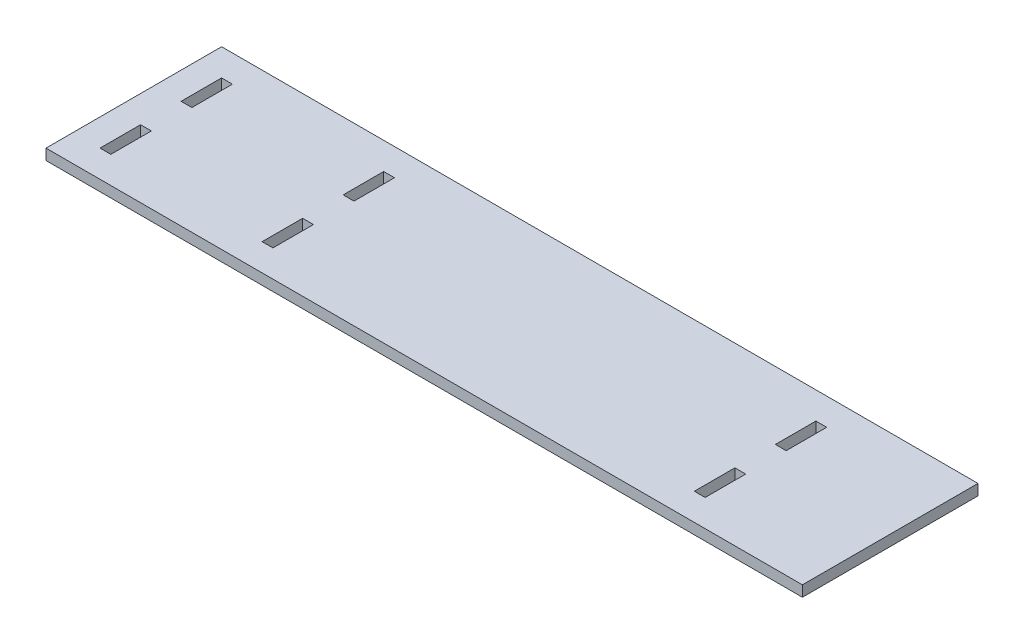
ISO-10303-21;
HEADER;
FILE_DESCRIPTION(('STEP AP214'),'2;1');
FILE_NAME('part.step','',(''),(''),'','','');
FILE_SCHEMA(('AUTOMOTIVE_DESIGN { 1 0 10303 214 1 1 1 1 }'));
ENDSEC;
DATA;
#1=APPLICATION_CONTEXT('core data for automotive mechanical design processes');
#2=APPLICATION_PROTOCOL_DEFINITION('international standard','automotive_design',2000,#1);
#3=PRODUCT_CONTEXT('',#1,'mechanical');
#4=PRODUCT('Part','Part','',(#3));
#5=PRODUCT_RELATED_PRODUCT_CATEGORY('part','',(#4));
#6=PRODUCT_DEFINITION_FORMATION('','',#4);
#7=PRODUCT_DEFINITION_CONTEXT('part definition',#1,'design');
#8=PRODUCT_DEFINITION('design','',#6,#7);
#9=PRODUCT_DEFINITION_SHAPE('','',#8);
#10=(LENGTH_UNIT() NAMED_UNIT(*) SI_UNIT(.MILLI.,.METRE.));
#11=(NAMED_UNIT(*) PLANE_ANGLE_UNIT() SI_UNIT($,.RADIAN.));
#12=(NAMED_UNIT(*) SI_UNIT($,.STERADIAN.) SOLID_ANGLE_UNIT());
#13=UNCERTAINTY_MEASURE_WITH_UNIT(LENGTH_MEASURE(1.E-05),#10,'distance_accuracy_value','');
#14=(GEOMETRIC_REPRESENTATION_CONTEXT(3) GLOBAL_UNCERTAINTY_ASSIGNED_CONTEXT((#13)) GLOBAL_UNIT_ASSIGNED_CONTEXT((#10,
#11,#12)) REPRESENTATION_CONTEXT('',''));
#15=CARTESIAN_POINT('',(0.,0.,0.));
#16=DIRECTION('',(0.,0.,1.));
#17=DIRECTION('',(1.,0.,0.));
#18=AXIS2_PLACEMENT_3D('',#15,#16,#17);
#19=CARTESIAN_POINT('',(0.,4.,0.));
#20=DIRECTION('',(0.,-1.,0.));
#21=DIRECTION('',(0.,0.,-1.));
#22=AXIS2_PLACEMENT_3D('',#19,#20,#21);
#23=PLANE('',#22);
#24=DIRECTION('',(-1.,0.,0.));
#25=VECTOR('',#24,1.);
#26=CARTESIAN_POINT('',(0.,4.,-9.99999999999997));
#27=LINE('',#26,#25);
#28=CARTESIAN_POINT('',(74.,4.,-10.));
#29=VERTEX_POINT('',#28);
#30=CARTESIAN_POINT('',(70.,4.,-10.));
#31=VERTEX_POINT('',#30);
#32=EDGE_CURVE('E56',#29,#31,#27,.T.);
#33=ORIENTED_EDGE('',*,*,#32,.T.);
#34=DIRECTION('',(0.,0.,-1.));
#35=VECTOR('',#34,1.);
#36=CARTESIAN_POINT('',(70.,4.,0.));
#37=LINE('',#36,#35);
#38=CARTESIAN_POINT('',(70.,4.,-25.));
#39=VERTEX_POINT('',#38);
#40=EDGE_CURVE('E301',#31,#39,#37,.T.);
#41=ORIENTED_EDGE('',*,*,#40,.T.);
#42=DIRECTION('',(-1.,0.,0.));
#43=VECTOR('',#42,1.);
#44=CARTESIAN_POINT('',(0.,4.,-25.0000000000001));
#45=LINE('',#44,#43);
#46=CARTESIAN_POINT('',(74.,4.,-25.));
#47=VERTEX_POINT('',#46);
#48=EDGE_CURVE('E304',#47,#39,#45,.T.);
#49=ORIENTED_EDGE('',*,*,#48,.F.);
#50=DIRECTION('',(0.,0.,-1.));
#51=VECTOR('',#50,1.);
#52=CARTESIAN_POINT('',(74.,4.,0.));
#53=LINE('',#52,#51);
#54=EDGE_CURVE('E308',#29,#47,#53,.T.);
#55=ORIENTED_EDGE('',*,*,#54,.F.);
#56=EDGE_LOOP('',(#33,#41,#49,#55));
#57=FACE_BOUND('',#56,.T.);
#58=DIRECTION('',(1.,0.,0.));
#59=VECTOR('',#58,1.);
#60=CARTESIAN_POINT('',(230.,4.,-55.));
#61=LINE('',#60,#59);
#62=CARTESIAN_POINT('',(230.,4.,-55.));
#63=VERTEX_POINT('',#62);
#64=CARTESIAN_POINT('',(234.,4.,-55.));
#65=VERTEX_POINT('',#64);
#66=EDGE_CURVE('E331',#63,#65,#61,.T.);
#67=ORIENTED_EDGE('',*,*,#66,.T.);
#68=DIRECTION('',(0.,0.,1.));
#69=VECTOR('',#68,1.);
#70=CARTESIAN_POINT('',(234.,4.,-55.));
#71=LINE('',#70,#69);
#72=CARTESIAN_POINT('',(234.,4.,-40.));
#73=VERTEX_POINT('',#72);
#74=EDGE_CURVE('E366',#65,#73,#71,.T.);
#75=ORIENTED_EDGE('',*,*,#74,.T.);
#76=DIRECTION('',(1.,0.,0.));
#77=VECTOR('',#76,1.);
#78=CARTESIAN_POINT('',(230.,4.,-40.));
#79=LINE('',#78,#77);
#80=CARTESIAN_POINT('',(230.,4.,-40.));
#81=VERTEX_POINT('',#80);
#82=EDGE_CURVE('E362',#81,#73,#79,.T.);
#83=ORIENTED_EDGE('',*,*,#82,.F.);
#84=DIRECTION('',(0.,0.,1.));
#85=VECTOR('',#84,1.);
#86=CARTESIAN_POINT('',(230.,4.,-55.));
#87=LINE('',#86,#85);
#88=EDGE_CURVE('E359',#63,#81,#87,.T.);
#89=ORIENTED_EDGE('',*,*,#88,.F.);
#90=EDGE_LOOP('',(#67,#75,#83,#89));
#91=FACE_BOUND('',#90,.T.);
#92=DIRECTION('',(0.,0.,1.));
#93=VECTOR('',#92,1.);
#94=CARTESIAN_POINT('',(230.,4.,-25.));
#95=LINE('',#94,#93);
#96=CARTESIAN_POINT('',(230.,4.,-25.));
#97=VERTEX_POINT('',#96);
#98=CARTESIAN_POINT('',(230.,4.,-10.));
#99=VERTEX_POINT('',#98);
#100=EDGE_CURVE('E243',#97,#99,#95,.T.);
#101=ORIENTED_EDGE('',*,*,#100,.F.);
#102=DIRECTION('',(-1.,0.,0.));
#103=VECTOR('',#102,1.);
#104=CARTESIAN_POINT('',(234.,4.,-25.));
#105=LINE('',#104,#103);
#106=CARTESIAN_POINT('',(234.,4.,-25.));
#107=VERTEX_POINT('',#106);
#108=EDGE_CURVE('E223',#107,#97,#105,.T.);
#109=ORIENTED_EDGE('',*,*,#108,.F.);
#110=DIRECTION('',(0.,0.,1.));
#111=VECTOR('',#110,1.);
#112=CARTESIAN_POINT('',(234.,4.,-25.));
#113=LINE('',#112,#111);
#114=CARTESIAN_POINT('',(234.,4.,-10.));
#115=VERTEX_POINT('',#114);
#116=EDGE_CURVE('E232',#107,#115,#113,.T.);
#117=ORIENTED_EDGE('',*,*,#116,.T.);
#118=DIRECTION('',(-1.,0.,0.));
#119=VECTOR('',#118,1.);
#120=CARTESIAN_POINT('',(234.,4.,-10.));
#121=LINE('',#120,#119);
#122=EDGE_CURVE('E238',#115,#99,#121,.T.);
#123=ORIENTED_EDGE('',*,*,#122,.T.);
#124=EDGE_LOOP('',(#101,#109,#117,#123));
#125=FACE_BOUND('',#124,.T.);
#126=DIRECTION('',(0.,0.,1.));
#127=VECTOR('',#126,1.);
#128=CARTESIAN_POINT('',(0.,4.,0.));
#129=LINE('',#128,#127);
#130=CARTESIAN_POINT('',(0.,4.,-65.));
#131=VERTEX_POINT('',#130);
#132=CARTESIAN_POINT('',(0.,4.,0.));
#133=VERTEX_POINT('',#132);
#134=EDGE_CURVE('E411',#131,#133,#129,.T.);
#135=ORIENTED_EDGE('',*,*,#134,.T.);
#136=DIRECTION('',(1.,0.,0.));
#137=VECTOR('',#136,1.);
#138=CARTESIAN_POINT('',(0.,4.,0.));
#139=LINE('',#138,#137);
#140=CARTESIAN_POINT('',(280.,4.,0.));
#141=VERTEX_POINT('',#140);
#142=EDGE_CURVE('E414',#133,#141,#139,.T.);
#143=ORIENTED_EDGE('',*,*,#142,.T.);
#144=DIRECTION('',(0.,0.,-1.));
#145=VECTOR('',#144,1.);
#146=CARTESIAN_POINT('',(280.,4.,0.));
#147=LINE('',#146,#145);
#148=CARTESIAN_POINT('',(280.,4.,-65.));
#149=VERTEX_POINT('',#148);
#150=EDGE_CURVE('E417',#141,#149,#147,.T.);
#151=ORIENTED_EDGE('',*,*,#150,.T.);
#152=DIRECTION('',(-1.,0.,0.));
#153=VECTOR('',#152,1.);
#154=CARTESIAN_POINT('',(0.,4.,-65.));
#155=LINE('',#154,#153);
#156=EDGE_CURVE('E419',#149,#131,#155,.T.);
#157=ORIENTED_EDGE('',*,*,#156,.T.);
#158=EDGE_LOOP('',(#135,#143,#151,#157));
#159=FACE_BOUND('',#158,.T.);
#160=DIRECTION('',(0.,0.,-1.));
#161=VECTOR('',#160,1.);
#162=CARTESIAN_POINT('',(10.,4.,0.));
#163=LINE('',#162,#161);
#164=CARTESIAN_POINT('',(10.,4.,-39.9999999999996));
#165=VERTEX_POINT('',#164);
#166=CARTESIAN_POINT('',(10.,4.,-54.9999999999996));
#167=VERTEX_POINT('',#166);
#168=EDGE_CURVE('E282',#165,#167,#163,.T.);
#169=ORIENTED_EDGE('',*,*,#168,.T.);
#170=DIRECTION('',(1.,0.,0.));
#171=VECTOR('',#170,1.);
#172=CARTESIAN_POINT('',(0.,4.,-54.9999999999996));
#173=LINE('',#172,#171);
#174=CARTESIAN_POINT('',(14.,4.,-54.9999999999996));
#175=VERTEX_POINT('',#174);
#176=EDGE_CURVE('E382',#167,#175,#173,.T.);
#177=ORIENTED_EDGE('',*,*,#176,.T.);
#178=DIRECTION('',(0.,0.,-1.));
#179=VECTOR('',#178,1.);
#180=CARTESIAN_POINT('',(14.,4.,0.));
#181=LINE('',#180,#179);
#182=CARTESIAN_POINT('',(14.,4.,-39.9999999999996));
#183=VERTEX_POINT('',#182);
#184=EDGE_CURVE('E396',#183,#175,#181,.T.);
#185=ORIENTED_EDGE('',*,*,#184,.F.);
#186=DIRECTION('',(1.,0.,0.));
#187=VECTOR('',#186,1.);
#188=CARTESIAN_POINT('',(0.,4.,-39.9999999999996));
#189=LINE('',#188,#187);
#190=EDGE_CURVE('E393',#165,#183,#189,.T.);
#191=ORIENTED_EDGE('',*,*,#190,.F.);
#192=EDGE_LOOP('',(#169,#177,#185,#191));
#193=FACE_BOUND('',#192,.T.);
#194=DIRECTION('',(0.,0.,-1.));
#195=VECTOR('',#194,1.);
#196=CARTESIAN_POINT('',(70.,4.,0.));
#197=LINE('',#196,#195);
#198=CARTESIAN_POINT('',(70.,4.,-40.));
#199=VERTEX_POINT('',#198);
#200=CARTESIAN_POINT('',(70.,4.,-55.));
#201=VERTEX_POINT('',#200);
#202=EDGE_CURVE('E300',#199,#201,#197,.T.);
#203=ORIENTED_EDGE('',*,*,#202,.T.);
#204=DIRECTION('',(1.,0.,0.));
#205=VECTOR('',#204,1.);
#206=CARTESIAN_POINT('',(0.,4.,-55.));
#207=LINE('',#206,#205);
#208=CARTESIAN_POINT('',(74.,4.,-55.));
#209=VERTEX_POINT('',#208);
#210=EDGE_CURVE('E332',#201,#209,#207,.T.);
#211=ORIENTED_EDGE('',*,*,#210,.T.);
#212=DIRECTION('',(0.,0.,-1.));
#213=VECTOR('',#212,1.);
#214=CARTESIAN_POINT('',(74.,4.,0.));
#215=LINE('',#214,#213);
#216=CARTESIAN_POINT('',(74.,4.,-40.));
#217=VERTEX_POINT('',#216);
#218=EDGE_CURVE('E335',#217,#209,#215,.T.);
#219=ORIENTED_EDGE('',*,*,#218,.F.);
#220=DIRECTION('',(1.,0.,0.));
#221=VECTOR('',#220,1.);
#222=CARTESIAN_POINT('',(0.,4.,-40.));
#223=LINE('',#222,#221);
#224=EDGE_CURVE('E339',#199,#217,#223,.T.);
#225=ORIENTED_EDGE('',*,*,#224,.F.);
#226=EDGE_LOOP('',(#203,#211,#219,#225));
#227=FACE_BOUND('',#226,.T.);
#228=DIRECTION('',(-1.,0.,0.));
#229=VECTOR('',#228,1.);
#230=CARTESIAN_POINT('',(0.,4.,-9.99999999999958));
#231=LINE('',#230,#229);
#232=CARTESIAN_POINT('',(14.,4.,-9.99999999999958));
#233=VERTEX_POINT('',#232);
#234=CARTESIAN_POINT('',(10.,4.,-9.99999999999958));
#235=VERTEX_POINT('',#234);
#236=EDGE_CURVE('E48',#233,#235,#231,.T.);
#237=ORIENTED_EDGE('',*,*,#236,.T.);
#238=DIRECTION('',(0.,0.,-1.));
#239=VECTOR('',#238,1.);
#240=CARTESIAN_POINT('',(10.,4.,0.));
#241=LINE('',#240,#239);
#242=CARTESIAN_POINT('',(10.,4.,-24.9999999999996));
#243=VERTEX_POINT('',#242);
#244=EDGE_CURVE('E271',#235,#243,#241,.T.);
#245=ORIENTED_EDGE('',*,*,#244,.T.);
#246=DIRECTION('',(-1.,0.,0.));
#247=VECTOR('',#246,1.);
#248=CARTESIAN_POINT('',(0.,4.,-24.9999999999996));
#249=LINE('',#248,#247);
#250=CARTESIAN_POINT('',(14.,4.,-24.9999999999996));
#251=VERTEX_POINT('',#250);
#252=EDGE_CURVE('E274',#251,#243,#249,.T.);
#253=ORIENTED_EDGE('',*,*,#252,.F.);
#254=DIRECTION('',(0.,0.,-1.));
#255=VECTOR('',#254,1.);
#256=CARTESIAN_POINT('',(14.,4.,0.));
#257=LINE('',#256,#255);
#258=EDGE_CURVE('E278',#233,#251,#257,.T.);
#259=ORIENTED_EDGE('',*,*,#258,.F.);
#260=EDGE_LOOP('',(#237,#245,#253,#259));
#261=FACE_BOUND('',#260,.T.);
#262=ADVANCED_FACE('F33',(#57,#91,#125,#159,#193,#227,#261),#23,.F.);
#263=CARTESIAN_POINT('',(0.,0.,0.));
#264=DIRECTION('',(0.,-1.,0.));
#265=DIRECTION('',(0.,0.,-1.));
#266=AXIS2_PLACEMENT_3D('',#263,#264,#265);
#267=PLANE('',#266);
#268=DIRECTION('',(-1.,0.,0.));
#269=VECTOR('',#268,1.);
#270=CARTESIAN_POINT('',(234.,0.,-25.));
#271=LINE('',#270,#269);
#272=CARTESIAN_POINT('',(234.,0.,-25.));
#273=VERTEX_POINT('',#272);
#274=CARTESIAN_POINT('',(230.,0.,-25.));
#275=VERTEX_POINT('',#274);
#276=EDGE_CURVE('E226',#273,#275,#271,.T.);
#277=ORIENTED_EDGE('',*,*,#276,.T.);
#278=DIRECTION('',(0.,0.,1.));
#279=VECTOR('',#278,1.);
#280=CARTESIAN_POINT('',(230.,0.,-25.));
#281=LINE('',#280,#279);
#282=CARTESIAN_POINT('',(230.,0.,-10.));
#283=VERTEX_POINT('',#282);
#284=EDGE_CURVE('E258',#275,#283,#281,.T.);
#285=ORIENTED_EDGE('',*,*,#284,.T.);
#286=DIRECTION('',(-1.,0.,0.));
#287=VECTOR('',#286,1.);
#288=CARTESIAN_POINT('',(234.,0.,-10.));
#289=LINE('',#288,#287);
#290=CARTESIAN_POINT('',(234.,0.,-10.));
#291=VERTEX_POINT('',#290);
#292=EDGE_CURVE('E254',#291,#283,#289,.T.);
#293=ORIENTED_EDGE('',*,*,#292,.F.);
#294=DIRECTION('',(0.,0.,1.));
#295=VECTOR('',#294,1.);
#296=CARTESIAN_POINT('',(234.,0.,-25.));
#297=LINE('',#296,#295);
#298=EDGE_CURVE('E252',#273,#291,#297,.T.);
#299=ORIENTED_EDGE('',*,*,#298,.F.);
#300=EDGE_LOOP('',(#277,#285,#293,#299));
#301=FACE_BOUND('',#300,.T.);
#302=DIRECTION('',(0.,0.,1.));
#303=VECTOR('',#302,1.);
#304=CARTESIAN_POINT('',(0.,0.,0.));
#305=LINE('',#304,#303);
#306=CARTESIAN_POINT('',(0.,0.,-65.));
#307=VERTEX_POINT('',#306);
#308=CARTESIAN_POINT('',(0.,0.,0.));
#309=VERTEX_POINT('',#308);
#310=EDGE_CURVE('E404',#307,#309,#305,.T.);
#311=ORIENTED_EDGE('',*,*,#310,.F.);
#312=DIRECTION('',(-1.,0.,0.));
#313=VECTOR('',#312,1.);
#314=CARTESIAN_POINT('',(0.,0.,-65.));
#315=LINE('',#314,#313);
#316=CARTESIAN_POINT('',(280.,0.,-65.));
#317=VERTEX_POINT('',#316);
#318=EDGE_CURVE('E415',#317,#307,#315,.T.);
#319=ORIENTED_EDGE('',*,*,#318,.F.);
#320=DIRECTION('',(0.,0.,-1.));
#321=VECTOR('',#320,1.);
#322=CARTESIAN_POINT('',(280.,0.,0.));
#323=LINE('',#322,#321);
#324=CARTESIAN_POINT('',(280.,0.,0.));
#325=VERTEX_POINT('',#324);
#326=EDGE_CURVE('E426',#325,#317,#323,.T.);
#327=ORIENTED_EDGE('',*,*,#326,.F.);
#328=DIRECTION('',(1.,0.,0.));
#329=VECTOR('',#328,1.);
#330=CARTESIAN_POINT('',(0.,0.,0.));
#331=LINE('',#330,#329);
#332=EDGE_CURVE('E424',#309,#325,#331,.T.);
#333=ORIENTED_EDGE('',*,*,#332,.F.);
#334=EDGE_LOOP('',(#311,#319,#327,#333));
#335=FACE_BOUND('',#334,.T.);
#336=DIRECTION('',(1.,0.,0.));
#337=VECTOR('',#336,1.);
#338=CARTESIAN_POINT('',(0.,0.,-54.9999999999996));
#339=LINE('',#338,#337);
#340=CARTESIAN_POINT('',(10.,0.,-54.9999999999996));
#341=VERTEX_POINT('',#340);
#342=CARTESIAN_POINT('',(14.,0.,-54.9999999999996));
#343=VERTEX_POINT('',#342);
#344=EDGE_CURVE('E388',#341,#343,#339,.T.);
#345=ORIENTED_EDGE('',*,*,#344,.F.);
#346=DIRECTION('',(0.,0.,-1.));
#347=VECTOR('',#346,1.);
#348=CARTESIAN_POINT('',(10.,0.,0.));
#349=LINE('',#348,#347);
#350=CARTESIAN_POINT('',(10.,0.,-39.9999999999996));
#351=VERTEX_POINT('',#350);
#352=EDGE_CURVE('E379',#351,#341,#349,.T.);
#353=ORIENTED_EDGE('',*,*,#352,.F.);
#354=DIRECTION('',(1.,0.,0.));
#355=VECTOR('',#354,1.);
#356=CARTESIAN_POINT('',(0.,0.,-39.9999999999996));
#357=LINE('',#356,#355);
#358=CARTESIAN_POINT('',(14.,0.,-39.9999999999996));
#359=VERTEX_POINT('',#358);
#360=EDGE_CURVE('E381',#351,#359,#357,.T.);
#361=ORIENTED_EDGE('',*,*,#360,.T.);
#362=DIRECTION('',(0.,0.,-1.));
#363=VECTOR('',#362,1.);
#364=CARTESIAN_POINT('',(14.,0.,0.));
#365=LINE('',#364,#363);
#366=EDGE_CURVE('E385',#359,#343,#365,.T.);
#367=ORIENTED_EDGE('',*,*,#366,.T.);
#368=EDGE_LOOP('',(#345,#353,#361,#367));
#369=FACE_BOUND('',#368,.T.);
#370=DIRECTION('',(0.,0.,1.));
#371=VECTOR('',#370,1.);
#372=CARTESIAN_POINT('',(234.,0.,-55.));
#373=LINE('',#372,#371);
#374=CARTESIAN_POINT('',(234.,0.,-55.));
#375=VERTEX_POINT('',#374);
#376=CARTESIAN_POINT('',(234.,0.,-40.));
#377=VERTEX_POINT('',#376);
#378=EDGE_CURVE('E376',#375,#377,#373,.T.);
#379=ORIENTED_EDGE('',*,*,#378,.F.);
#380=DIRECTION('',(1.,0.,0.));
#381=VECTOR('',#380,1.);
#382=CARTESIAN_POINT('',(230.,0.,-55.));
#383=LINE('',#382,#381);
#384=CARTESIAN_POINT('',(230.,0.,-55.));
#385=VERTEX_POINT('',#384);
#386=EDGE_CURVE('E363',#385,#375,#383,.T.);
#387=ORIENTED_EDGE('',*,*,#386,.F.);
#388=DIRECTION('',(0.,0.,1.));
#389=VECTOR('',#388,1.);
#390=CARTESIAN_POINT('',(230.,0.,-55.));
#391=LINE('',#390,#389);
#392=CARTESIAN_POINT('',(230.,0.,-40.));
#393=VERTEX_POINT('',#392);
#394=EDGE_CURVE('E358',#385,#393,#391,.T.);
#395=ORIENTED_EDGE('',*,*,#394,.T.);
#396=DIRECTION('',(1.,0.,0.));
#397=VECTOR('',#396,1.);
#398=CARTESIAN_POINT('',(230.,0.,-40.));
#399=LINE('',#398,#397);
#400=EDGE_CURVE('E373',#393,#377,#399,.T.);
#401=ORIENTED_EDGE('',*,*,#400,.T.);
#402=EDGE_LOOP('',(#379,#387,#395,#401));
#403=FACE_BOUND('',#402,.T.);
#404=DIRECTION('',(1.,0.,0.));
#405=VECTOR('',#404,1.);
#406=CARTESIAN_POINT('',(0.,0.,-55.));
#407=LINE('',#406,#405);
#408=CARTESIAN_POINT('',(70.,0.,-55.));
#409=VERTEX_POINT('',#408);
#410=CARTESIAN_POINT('',(74.,0.,-55.));
#411=VERTEX_POINT('',#410);
#412=EDGE_CURVE('E323',#409,#411,#407,.T.);
#413=ORIENTED_EDGE('',*,*,#412,.F.);
#414=DIRECTION('',(0.,0.,-1.));
#415=VECTOR('',#414,1.);
#416=CARTESIAN_POINT('',(70.,0.,0.));
#417=LINE('',#416,#415);
#418=CARTESIAN_POINT('',(70.,0.,-40.));
#419=VERTEX_POINT('',#418);
#420=EDGE_CURVE('E336',#419,#409,#417,.T.);
#421=ORIENTED_EDGE('',*,*,#420,.F.);
#422=DIRECTION('',(1.,0.,0.));
#423=VECTOR('',#422,1.);
#424=CARTESIAN_POINT('',(0.,0.,-40.));
#425=LINE('',#424,#423);
#426=CARTESIAN_POINT('',(74.,0.,-40.));
#427=VERTEX_POINT('',#426);
#428=EDGE_CURVE('E348',#419,#427,#425,.T.);
#429=ORIENTED_EDGE('',*,*,#428,.T.);
#430=DIRECTION('',(0.,0.,-1.));
#431=VECTOR('',#430,1.);
#432=CARTESIAN_POINT('',(74.,0.,0.));
#433=LINE('',#432,#431);
#434=EDGE_CURVE('E345',#427,#411,#433,.T.);
#435=ORIENTED_EDGE('',*,*,#434,.T.);
#436=EDGE_LOOP('',(#413,#421,#429,#435));
#437=FACE_BOUND('',#436,.T.);
#438=DIRECTION('',(0.,0.,-1.));
#439=VECTOR('',#438,1.);
#440=CARTESIAN_POINT('',(70.,0.,0.));
#441=LINE('',#440,#439);
#442=CARTESIAN_POINT('',(70.,0.,-10.));
#443=VERTEX_POINT('',#442);
#444=CARTESIAN_POINT('',(70.,0.,-25.));
#445=VERTEX_POINT('',#444);
#446=EDGE_CURVE('E293',#443,#445,#441,.T.);
#447=ORIENTED_EDGE('',*,*,#446,.F.);
#448=DIRECTION('',(-1.,0.,0.));
#449=VECTOR('',#448,1.);
#450=CARTESIAN_POINT('',(0.,0.,-9.99999999999997));
#451=LINE('',#450,#449);
#452=CARTESIAN_POINT('',(74.,0.,-10.));
#453=VERTEX_POINT('',#452);
#454=EDGE_CURVE('E305',#453,#443,#451,.T.);
#455=ORIENTED_EDGE('',*,*,#454,.F.);
#456=DIRECTION('',(0.,0.,-1.));
#457=VECTOR('',#456,1.);
#458=CARTESIAN_POINT('',(74.,0.,0.));
#459=LINE('',#458,#457);
#460=CARTESIAN_POINT('',(74.,0.,-25.));
#461=VERTEX_POINT('',#460);
#462=EDGE_CURVE('E316',#453,#461,#459,.T.);
#463=ORIENTED_EDGE('',*,*,#462,.T.);
#464=DIRECTION('',(-1.,0.,0.));
#465=VECTOR('',#464,1.);
#466=CARTESIAN_POINT('',(0.,0.,-25.0000000000001));
#467=LINE('',#466,#465);
#468=EDGE_CURVE('E313',#461,#445,#467,.T.);
#469=ORIENTED_EDGE('',*,*,#468,.T.);
#470=EDGE_LOOP('',(#447,#455,#463,#469));
#471=FACE_BOUND('',#470,.T.);
#472=DIRECTION('',(0.,0.,-1.));
#473=VECTOR('',#472,1.);
#474=CARTESIAN_POINT('',(10.,0.,0.));
#475=LINE('',#474,#473);
#476=CARTESIAN_POINT('',(10.,0.,-9.99999999999958));
#477=VERTEX_POINT('',#476);
#478=CARTESIAN_POINT('',(10.,0.,-24.9999999999996));
#479=VERTEX_POINT('',#478);
#480=EDGE_CURVE('E264',#477,#479,#475,.T.);
#481=ORIENTED_EDGE('',*,*,#480,.F.);
#482=DIRECTION('',(-1.,0.,0.));
#483=VECTOR('',#482,1.);
#484=CARTESIAN_POINT('',(0.,0.,-9.99999999999958));
#485=LINE('',#484,#483);
#486=CARTESIAN_POINT('',(14.,0.,-9.99999999999958));
#487=VERTEX_POINT('',#486);
#488=EDGE_CURVE('E275',#487,#477,#485,.T.);
#489=ORIENTED_EDGE('',*,*,#488,.F.);
#490=DIRECTION('',(0.,0.,-1.));
#491=VECTOR('',#490,1.);
#492=CARTESIAN_POINT('',(14.,0.,0.));
#493=LINE('',#492,#491);
#494=CARTESIAN_POINT('',(14.,0.,-24.9999999999996));
#495=VERTEX_POINT('',#494);
#496=EDGE_CURVE('E287',#487,#495,#493,.T.);
#497=ORIENTED_EDGE('',*,*,#496,.T.);
#498=DIRECTION('',(-1.,0.,0.));
#499=VECTOR('',#498,1.);
#500=CARTESIAN_POINT('',(0.,0.,-24.9999999999996));
#501=LINE('',#500,#499);
#502=EDGE_CURVE('E284',#495,#479,#501,.T.);
#503=ORIENTED_EDGE('',*,*,#502,.T.);
#504=EDGE_LOOP('',(#481,#489,#497,#503));
#505=FACE_BOUND('',#504,.T.);
#506=ADVANCED_FACE('F444',(#301,#335,#369,#403,#437,#471,#505),#267,.T.);
#507=CARTESIAN_POINT('',(0.,4.,0.));
#508=DIRECTION('',(1.,0.,0.));
#509=DIRECTION('',(0.,0.,-1.));
#510=AXIS2_PLACEMENT_3D('',#507,#508,#509);
#511=PLANE('',#510);
#512=ORIENTED_EDGE('',*,*,#310,.T.);
#513=DIRECTION('',(0.,-1.,0.));
#514=VECTOR('',#513,1.);
#515=CARTESIAN_POINT('',(0.,4.,0.));
#516=LINE('',#515,#514);
#517=EDGE_CURVE('E11',#133,#309,#516,.T.);
#518=ORIENTED_EDGE('',*,*,#517,.F.);
#519=ORIENTED_EDGE('',*,*,#134,.F.);
#520=DIRECTION('',(0.,-1.,0.));
#521=VECTOR('',#520,1.);
#522=CARTESIAN_POINT('',(0.,4.,-65.));
#523=LINE('',#522,#521);
#524=EDGE_CURVE('E421',#131,#307,#523,.T.);
#525=ORIENTED_EDGE('',*,*,#524,.T.);
#526=EDGE_LOOP('',(#512,#518,#519,#525));
#527=FACE_BOUND('',#526,.T.);
#528=ADVANCED_FACE('F35',(#527),#511,.F.);
#529=CARTESIAN_POINT('',(0.,4.,0.));
#530=DIRECTION('',(0.,0.,-1.));
#531=DIRECTION('',(-1.,0.,0.));
#532=AXIS2_PLACEMENT_3D('',#529,#530,#531);
#533=PLANE('',#532);
#534=ORIENTED_EDGE('',*,*,#332,.T.);
#535=DIRECTION('',(0.,-1.,0.));
#536=VECTOR('',#535,1.);
#537=CARTESIAN_POINT('',(280.,4.,0.));
#538=LINE('',#537,#536);
#539=EDGE_CURVE('E41',#141,#325,#538,.T.);
#540=ORIENTED_EDGE('',*,*,#539,.F.);
#541=ORIENTED_EDGE('',*,*,#142,.F.);
#542=ORIENTED_EDGE('',*,*,#517,.T.);
#543=EDGE_LOOP('',(#534,#540,#541,#542));
#544=FACE_BOUND('',#543,.T.);
#545=ADVANCED_FACE('F454',(#544),#533,.F.);
#546=CARTESIAN_POINT('',(280.,4.,0.));
#547=DIRECTION('',(-1.,0.,0.));
#548=DIRECTION('',(0.,0.,1.));
#549=AXIS2_PLACEMENT_3D('',#546,#547,#548);
#550=PLANE('',#549);
#551=ORIENTED_EDGE('',*,*,#326,.T.);
#552=DIRECTION('',(0.,-1.,0.));
#553=VECTOR('',#552,1.);
#554=CARTESIAN_POINT('',(280.,4.,-65.));
#555=LINE('',#554,#553);
#556=EDGE_CURVE('E431',#149,#317,#555,.T.);
#557=ORIENTED_EDGE('',*,*,#556,.F.);
#558=ORIENTED_EDGE('',*,*,#150,.F.);
#559=ORIENTED_EDGE('',*,*,#539,.T.);
#560=EDGE_LOOP('',(#551,#557,#558,#559));
#561=FACE_BOUND('',#560,.T.);
#562=ADVANCED_FACE('F438',(#561),#550,.F.);
#563=CARTESIAN_POINT('',(0.,4.,-65.));
#564=DIRECTION('',(0.,0.,1.));
#565=DIRECTION('',(1.,0.,0.));
#566=AXIS2_PLACEMENT_3D('',#563,#564,#565);
#567=PLANE('',#566);
#568=ORIENTED_EDGE('',*,*,#318,.T.);
#569=ORIENTED_EDGE('',*,*,#524,.F.);
#570=ORIENTED_EDGE('',*,*,#156,.F.);
#571=ORIENTED_EDGE('',*,*,#556,.T.);
#572=EDGE_LOOP('',(#568,#569,#570,#571));
#573=FACE_BOUND('',#572,.T.);
#574=ADVANCED_FACE('F448',(#573),#567,.F.);
#575=CARTESIAN_POINT('',(10.,0.,0.));
#576=DIRECTION('',(1.,0.,0.));
#577=DIRECTION('',(0.,0.,-1.));
#578=AXIS2_PLACEMENT_3D('',#575,#576,#577);
#579=PLANE('',#578);
#580=ORIENTED_EDGE('',*,*,#168,.F.);
#581=DIRECTION('',(0.,1.,0.));
#582=VECTOR('',#581,1.);
#583=CARTESIAN_POINT('',(10.,0.,-39.9999999999996));
#584=LINE('',#583,#582);
#585=EDGE_CURVE('E390',#351,#165,#584,.T.);
#586=ORIENTED_EDGE('',*,*,#585,.F.);
#587=ORIENTED_EDGE('',*,*,#352,.T.);
#588=DIRECTION('',(0.,1.,0.));
#589=VECTOR('',#588,1.);
#590=CARTESIAN_POINT('',(10.,0.,-54.9999999999996));
#591=LINE('',#590,#589);
#592=EDGE_CURVE('E401',#341,#167,#591,.T.);
#593=ORIENTED_EDGE('',*,*,#592,.T.);
#594=EDGE_LOOP('',(#580,#586,#587,#593));
#595=FACE_BOUND('',#594,.T.);
#596=ADVANCED_FACE('F471',(#595),#579,.T.);
#597=CARTESIAN_POINT('',(0.,0.,-54.9999999999996));
#598=DIRECTION('',(0.,0.,1.));
#599=DIRECTION('',(1.,0.,0.));
#600=AXIS2_PLACEMENT_3D('',#597,#598,#599);
#601=PLANE('',#600);
#602=ORIENTED_EDGE('',*,*,#176,.F.);
#603=ORIENTED_EDGE('',*,*,#592,.F.);
#604=ORIENTED_EDGE('',*,*,#344,.T.);
#605=DIRECTION('',(0.,1.,0.));
#606=VECTOR('',#605,1.);
#607=CARTESIAN_POINT('',(14.,0.,-54.9999999999996));
#608=LINE('',#607,#606);
#609=EDGE_CURVE('E405',#343,#175,#608,.T.);
#610=ORIENTED_EDGE('',*,*,#609,.T.);
#611=EDGE_LOOP('',(#602,#603,#604,#610));
#612=FACE_BOUND('',#611,.T.);
#613=ADVANCED_FACE('F478',(#612),#601,.T.);
#614=CARTESIAN_POINT('',(14.,0.,0.));
#615=DIRECTION('',(1.,0.,0.));
#616=DIRECTION('',(0.,0.,-1.));
#617=AXIS2_PLACEMENT_3D('',#614,#615,#616);
#618=PLANE('',#617);
#619=ORIENTED_EDGE('',*,*,#184,.T.);
#620=ORIENTED_EDGE('',*,*,#609,.F.);
#621=ORIENTED_EDGE('',*,*,#366,.F.);
#622=DIRECTION('',(0.,1.,0.));
#623=VECTOR('',#622,1.);
#624=CARTESIAN_POINT('',(14.,0.,-39.9999999999996));
#625=LINE('',#624,#623);
#626=EDGE_CURVE('E407',#359,#183,#625,.T.);
#627=ORIENTED_EDGE('',*,*,#626,.T.);
#628=EDGE_LOOP('',(#619,#620,#621,#627));
#629=FACE_BOUND('',#628,.T.);
#630=ADVANCED_FACE('F483',(#629),#618,.F.);
#631=CARTESIAN_POINT('',(0.,0.,-39.9999999999996));
#632=DIRECTION('',(0.,0.,1.));
#633=DIRECTION('',(1.,0.,0.));
#634=AXIS2_PLACEMENT_3D('',#631,#632,#633);
#635=PLANE('',#634);
#636=ORIENTED_EDGE('',*,*,#190,.T.);
#637=ORIENTED_EDGE('',*,*,#626,.F.);
#638=ORIENTED_EDGE('',*,*,#360,.F.);
#639=ORIENTED_EDGE('',*,*,#585,.T.);
#640=EDGE_LOOP('',(#636,#637,#638,#639));
#641=FACE_BOUND('',#640,.T.);
#642=ADVANCED_FACE('F490',(#641),#635,.F.);
#643=CARTESIAN_POINT('',(234.,0.,-25.));
#644=DIRECTION('',(0.,0.,-1.));
#645=DIRECTION('',(-1.,0.,0.));
#646=AXIS2_PLACEMENT_3D('',#643,#644,#645);
#647=PLANE('',#646);
#648=ORIENTED_EDGE('',*,*,#108,.T.);
#649=DIRECTION('',(0.,1.,0.));
#650=VECTOR('',#649,1.);
#651=CARTESIAN_POINT('',(230.,0.,-25.));
#652=LINE('',#651,#650);
#653=EDGE_CURVE('E255',#275,#97,#652,.T.);
#654=ORIENTED_EDGE('',*,*,#653,.F.);
#655=ORIENTED_EDGE('',*,*,#276,.F.);
#656=DIRECTION('',(0.,1.,0.));
#657=VECTOR('',#656,1.);
#658=CARTESIAN_POINT('',(234.,0.,-25.));
#659=LINE('',#658,#657);
#660=EDGE_CURVE('E219',#273,#107,#659,.T.);
#661=ORIENTED_EDGE('',*,*,#660,.T.);
#662=EDGE_LOOP('',(#648,#654,#655,#661));
#663=FACE_BOUND('',#662,.T.);
#664=ADVANCED_FACE('F221',(#663),#647,.F.);
#665=CARTESIAN_POINT('',(234.,0.,-25.));
#666=DIRECTION('',(-1.,0.,0.));
#667=DIRECTION('',(0.,0.,1.));
#668=AXIS2_PLACEMENT_3D('',#665,#666,#667);
#669=PLANE('',#668);
#670=ORIENTED_EDGE('',*,*,#116,.F.);
#671=ORIENTED_EDGE('',*,*,#660,.F.);
#672=ORIENTED_EDGE('',*,*,#298,.T.);
#673=DIRECTION('',(0.,1.,0.));
#674=VECTOR('',#673,1.);
#675=CARTESIAN_POINT('',(234.,0.,-10.));
#676=LINE('',#675,#674);
#677=EDGE_CURVE('E229',#291,#115,#676,.T.);
#678=ORIENTED_EDGE('',*,*,#677,.T.);
#679=EDGE_LOOP('',(#670,#671,#672,#678));
#680=FACE_BOUND('',#679,.T.);
#681=ADVANCED_FACE('F233',(#680),#669,.T.);
#682=CARTESIAN_POINT('',(234.,0.,-10.));
#683=DIRECTION('',(0.,0.,-1.));
#684=DIRECTION('',(-1.,0.,0.));
#685=AXIS2_PLACEMENT_3D('',#682,#683,#684);
#686=PLANE('',#685);
#687=ORIENTED_EDGE('',*,*,#122,.F.);
#688=ORIENTED_EDGE('',*,*,#677,.F.);
#689=ORIENTED_EDGE('',*,*,#292,.T.);
#690=DIRECTION('',(0.,1.,0.));
#691=VECTOR('',#690,1.);
#692=CARTESIAN_POINT('',(230.,0.,-10.));
#693=LINE('',#692,#691);
#694=EDGE_CURVE('E602',#283,#99,#693,.T.);
#695=ORIENTED_EDGE('',*,*,#694,.T.);
#696=EDGE_LOOP('',(#687,#688,#689,#695));
#697=FACE_BOUND('',#696,.T.);
#698=ADVANCED_FACE('F592',(#697),#686,.T.);
#699=CARTESIAN_POINT('',(230.,0.,-25.));
#700=DIRECTION('',(-1.,0.,0.));
#701=DIRECTION('',(0.,0.,1.));
#702=AXIS2_PLACEMENT_3D('',#699,#700,#701);
#703=PLANE('',#702);
#704=ORIENTED_EDGE('',*,*,#100,.T.);
#705=ORIENTED_EDGE('',*,*,#694,.F.);
#706=ORIENTED_EDGE('',*,*,#284,.F.);
#707=ORIENTED_EDGE('',*,*,#653,.T.);
#708=EDGE_LOOP('',(#704,#705,#706,#707));
#709=FACE_BOUND('',#708,.T.);
#710=ADVANCED_FACE('F571',(#709),#703,.F.);
#711=CARTESIAN_POINT('',(230.,0.,-55.));
#712=DIRECTION('',(0.,0.,1.));
#713=DIRECTION('',(1.,0.,0.));
#714=AXIS2_PLACEMENT_3D('',#711,#712,#713);
#715=PLANE('',#714);
#716=ORIENTED_EDGE('',*,*,#66,.F.);
#717=DIRECTION('',(0.,1.,0.));
#718=VECTOR('',#717,1.);
#719=CARTESIAN_POINT('',(230.,0.,-55.));
#720=LINE('',#719,#718);
#721=EDGE_CURVE('E355',#385,#63,#720,.T.);
#722=ORIENTED_EDGE('',*,*,#721,.F.);
#723=ORIENTED_EDGE('',*,*,#386,.T.);
#724=DIRECTION('',(0.,1.,0.));
#725=VECTOR('',#724,1.);
#726=CARTESIAN_POINT('',(234.,0.,-55.));
#727=LINE('',#726,#725);
#728=EDGE_CURVE('E244',#375,#65,#727,.T.);
#729=ORIENTED_EDGE('',*,*,#728,.T.);
#730=EDGE_LOOP('',(#716,#722,#723,#729));
#731=FACE_BOUND('',#730,.T.);
#732=ADVANCED_FACE('F567',(#731),#715,.T.);
#733=CARTESIAN_POINT('',(234.,0.,-55.));
#734=DIRECTION('',(-1.,0.,0.));
#735=DIRECTION('',(0.,0.,1.));
#736=AXIS2_PLACEMENT_3D('',#733,#734,#735);
#737=PLANE('',#736);
#738=ORIENTED_EDGE('',*,*,#74,.F.);
#739=ORIENTED_EDGE('',*,*,#728,.F.);
#740=ORIENTED_EDGE('',*,*,#378,.T.);
#741=DIRECTION('',(0.,1.,0.));
#742=VECTOR('',#741,1.);
#743=CARTESIAN_POINT('',(234.,0.,-40.));
#744=LINE('',#743,#742);
#745=EDGE_CURVE('E247',#377,#73,#744,.T.);
#746=ORIENTED_EDGE('',*,*,#745,.T.);
#747=EDGE_LOOP('',(#738,#739,#740,#746));
#748=FACE_BOUND('',#747,.T.);
#749=ADVANCED_FACE('F570',(#748),#737,.T.);
#750=CARTESIAN_POINT('',(230.,0.,-40.));
#751=DIRECTION('',(0.,0.,1.));
#752=DIRECTION('',(1.,0.,0.));
#753=AXIS2_PLACEMENT_3D('',#750,#751,#752);
#754=PLANE('',#753);
#755=ORIENTED_EDGE('',*,*,#82,.T.);
#756=ORIENTED_EDGE('',*,*,#745,.F.);
#757=ORIENTED_EDGE('',*,*,#400,.F.);
#758=DIRECTION('',(0.,1.,0.));
#759=VECTOR('',#758,1.);
#760=CARTESIAN_POINT('',(230.,0.,-40.));
#761=LINE('',#760,#759);
#762=EDGE_CURVE('E353',#393,#81,#761,.T.);
#763=ORIENTED_EDGE('',*,*,#762,.T.);
#764=EDGE_LOOP('',(#755,#756,#757,#763));
#765=FACE_BOUND('',#764,.T.);
#766=ADVANCED_FACE('F575',(#765),#754,.F.);
#767=CARTESIAN_POINT('',(230.,0.,-55.));
#768=DIRECTION('',(-1.,0.,0.));
#769=DIRECTION('',(0.,0.,1.));
#770=AXIS2_PLACEMENT_3D('',#767,#768,#769);
#771=PLANE('',#770);
#772=ORIENTED_EDGE('',*,*,#88,.T.);
#773=ORIENTED_EDGE('',*,*,#762,.F.);
#774=ORIENTED_EDGE('',*,*,#394,.F.);
#775=ORIENTED_EDGE('',*,*,#721,.T.);
#776=EDGE_LOOP('',(#772,#773,#774,#775));
#777=FACE_BOUND('',#776,.T.);
#778=ADVANCED_FACE('F555',(#777),#771,.F.);
#779=CARTESIAN_POINT('',(70.,0.,0.));
#780=DIRECTION('',(1.,0.,0.));
#781=DIRECTION('',(0.,0.,-1.));
#782=AXIS2_PLACEMENT_3D('',#779,#780,#781);
#783=PLANE('',#782);
#784=ORIENTED_EDGE('',*,*,#202,.F.);
#785=DIRECTION('',(0.,1.,0.));
#786=VECTOR('',#785,1.);
#787=CARTESIAN_POINT('',(70.,0.,-40.));
#788=LINE('',#787,#786);
#789=EDGE_CURVE('E320',#419,#199,#788,.T.);
#790=ORIENTED_EDGE('',*,*,#789,.F.);
#791=ORIENTED_EDGE('',*,*,#420,.T.);
#792=DIRECTION('',(0.,1.,0.));
#793=VECTOR('',#792,1.);
#794=CARTESIAN_POINT('',(70.,0.,-55.));
#795=LINE('',#794,#793);
#796=EDGE_CURVE('E328',#409,#201,#795,.T.);
#797=ORIENTED_EDGE('',*,*,#796,.T.);
#798=EDGE_LOOP('',(#784,#790,#791,#797));
#799=FACE_BOUND('',#798,.T.);
#800=ADVANCED_FACE('F551',(#799),#783,.T.);
#801=CARTESIAN_POINT('',(0.,0.,-55.));
#802=DIRECTION('',(0.,0.,1.));
#803=DIRECTION('',(1.,0.,0.));
#804=AXIS2_PLACEMENT_3D('',#801,#802,#803);
#805=PLANE('',#804);
#806=ORIENTED_EDGE('',*,*,#210,.F.);
#807=ORIENTED_EDGE('',*,*,#796,.F.);
#808=ORIENTED_EDGE('',*,*,#412,.T.);
#809=DIRECTION('',(0.,1.,0.));
#810=VECTOR('',#809,1.);
#811=CARTESIAN_POINT('',(74.,0.,-55.));
#812=LINE('',#811,#810);
#813=EDGE_CURVE('E326',#411,#209,#812,.T.);
#814=ORIENTED_EDGE('',*,*,#813,.T.);
#815=EDGE_LOOP('',(#806,#807,#808,#814));
#816=FACE_BOUND('',#815,.T.);
#817=ADVANCED_FACE('F554',(#816),#805,.T.);
#818=CARTESIAN_POINT('',(74.,0.,0.));
#819=DIRECTION('',(1.,0.,0.));
#820=DIRECTION('',(0.,0.,-1.));
#821=AXIS2_PLACEMENT_3D('',#818,#819,#820);
#822=PLANE('',#821);
#823=ORIENTED_EDGE('',*,*,#218,.T.);
#824=ORIENTED_EDGE('',*,*,#813,.F.);
#825=ORIENTED_EDGE('',*,*,#434,.F.);
#826=DIRECTION('',(0.,1.,0.));
#827=VECTOR('',#826,1.);
#828=CARTESIAN_POINT('',(74.,0.,-40.));
#829=LINE('',#828,#827);
#830=EDGE_CURVE('E324',#427,#217,#829,.T.);
#831=ORIENTED_EDGE('',*,*,#830,.T.);
#832=EDGE_LOOP('',(#823,#824,#825,#831));
#833=FACE_BOUND('',#832,.T.);
#834=ADVANCED_FACE('F559',(#833),#822,.F.);
#835=CARTESIAN_POINT('',(0.,0.,-40.));
#836=DIRECTION('',(0.,0.,1.));
#837=DIRECTION('',(1.,0.,0.));
#838=AXIS2_PLACEMENT_3D('',#835,#836,#837);
#839=PLANE('',#838);
#840=ORIENTED_EDGE('',*,*,#224,.T.);
#841=ORIENTED_EDGE('',*,*,#830,.F.);
#842=ORIENTED_EDGE('',*,*,#428,.F.);
#843=ORIENTED_EDGE('',*,*,#789,.T.);
#844=EDGE_LOOP('',(#840,#841,#842,#843));
#845=FACE_BOUND('',#844,.T.);
#846=ADVANCED_FACE('F539',(#845),#839,.F.);
#847=CARTESIAN_POINT('',(0.,0.,-9.99999999999997));
#848=DIRECTION('',(0.,0.,-1.));
#849=DIRECTION('',(-1.,0.,0.));
#850=AXIS2_PLACEMENT_3D('',#847,#848,#849);
#851=PLANE('',#850);
#852=ORIENTED_EDGE('',*,*,#32,.F.);
#853=DIRECTION('',(0.,1.,0.));
#854=VECTOR('',#853,1.);
#855=CARTESIAN_POINT('',(74.,0.,-10.));
#856=LINE('',#855,#854);
#857=EDGE_CURVE('E291',#453,#29,#856,.T.);
#858=ORIENTED_EDGE('',*,*,#857,.F.);
#859=ORIENTED_EDGE('',*,*,#454,.T.);
#860=DIRECTION('',(0.,1.,0.));
#861=VECTOR('',#860,1.);
#862=CARTESIAN_POINT('',(70.,0.,-10.));
#863=LINE('',#862,#861);
#864=EDGE_CURVE('E298',#443,#31,#863,.T.);
#865=ORIENTED_EDGE('',*,*,#864,.T.);
#866=EDGE_LOOP('',(#852,#858,#859,#865));
#867=FACE_BOUND('',#866,.T.);
#868=ADVANCED_FACE('F535',(#867),#851,.T.);
#869=CARTESIAN_POINT('',(70.,0.,0.));
#870=DIRECTION('',(1.,0.,0.));
#871=DIRECTION('',(0.,0.,-1.));
#872=AXIS2_PLACEMENT_3D('',#869,#870,#871);
#873=PLANE('',#872);
#874=ORIENTED_EDGE('',*,*,#40,.F.);
#875=ORIENTED_EDGE('',*,*,#864,.F.);
#876=ORIENTED_EDGE('',*,*,#446,.T.);
#877=DIRECTION('',(0.,1.,0.));
#878=VECTOR('',#877,1.);
#879=CARTESIAN_POINT('',(70.,0.,-25.));
#880=LINE('',#879,#878);
#881=EDGE_CURVE('E296',#445,#39,#880,.T.);
#882=ORIENTED_EDGE('',*,*,#881,.T.);
#883=EDGE_LOOP('',(#874,#875,#876,#882));
#884=FACE_BOUND('',#883,.T.);
#885=ADVANCED_FACE('F538',(#884),#873,.T.);
#886=CARTESIAN_POINT('',(0.,0.,-25.0000000000001));
#887=DIRECTION('',(0.,0.,-1.));
#888=DIRECTION('',(-1.,0.,0.));
#889=AXIS2_PLACEMENT_3D('',#886,#887,#888);
#890=PLANE('',#889);
#891=ORIENTED_EDGE('',*,*,#48,.T.);
#892=ORIENTED_EDGE('',*,*,#881,.F.);
#893=ORIENTED_EDGE('',*,*,#468,.F.);
#894=DIRECTION('',(0.,1.,0.));
#895=VECTOR('',#894,1.);
#896=CARTESIAN_POINT('',(74.,0.,-25.));
#897=LINE('',#896,#895);
#898=EDGE_CURVE('E294',#461,#47,#897,.T.);
#899=ORIENTED_EDGE('',*,*,#898,.T.);
#900=EDGE_LOOP('',(#891,#892,#893,#899));
#901=FACE_BOUND('',#900,.T.);
#902=ADVANCED_FACE('F543',(#901),#890,.F.);
#903=CARTESIAN_POINT('',(74.,0.,0.));
#904=DIRECTION('',(1.,0.,0.));
#905=DIRECTION('',(0.,0.,-1.));
#906=AXIS2_PLACEMENT_3D('',#903,#904,#905);
#907=PLANE('',#906);
#908=ORIENTED_EDGE('',*,*,#54,.T.);
#909=ORIENTED_EDGE('',*,*,#898,.F.);
#910=ORIENTED_EDGE('',*,*,#462,.F.);
#911=ORIENTED_EDGE('',*,*,#857,.T.);
#912=EDGE_LOOP('',(#908,#909,#910,#911));
#913=FACE_BOUND('',#912,.T.);
#914=ADVANCED_FACE('F540',(#913),#907,.F.);
#915=CARTESIAN_POINT('',(0.,0.,-9.99999999999958));
#916=DIRECTION('',(0.,0.,-1.));
#917=DIRECTION('',(-1.,0.,0.));
#918=AXIS2_PLACEMENT_3D('',#915,#916,#917);
#919=PLANE('',#918);
#920=ORIENTED_EDGE('',*,*,#236,.F.);
#921=DIRECTION('',(0.,1.,0.));
#922=VECTOR('',#921,1.);
#923=CARTESIAN_POINT('',(14.,0.,-9.99999999999958));
#924=LINE('',#923,#922);
#925=EDGE_CURVE('E262',#487,#233,#924,.T.);
#926=ORIENTED_EDGE('',*,*,#925,.F.);
#927=ORIENTED_EDGE('',*,*,#488,.T.);
#928=DIRECTION('',(0.,1.,0.));
#929=VECTOR('',#928,1.);
#930=CARTESIAN_POINT('',(10.,0.,-9.99999999999958));
#931=LINE('',#930,#929);
#932=EDGE_CURVE('E269',#477,#235,#931,.T.);
#933=ORIENTED_EDGE('',*,*,#932,.T.);
#934=EDGE_LOOP('',(#920,#926,#927,#933));
#935=FACE_BOUND('',#934,.T.);
#936=ADVANCED_FACE('F520',(#935),#919,.T.);
#937=CARTESIAN_POINT('',(10.,0.,0.));
#938=DIRECTION('',(1.,0.,0.));
#939=DIRECTION('',(0.,0.,-1.));
#940=AXIS2_PLACEMENT_3D('',#937,#938,#939);
#941=PLANE('',#940);
#942=ORIENTED_EDGE('',*,*,#244,.F.);
#943=ORIENTED_EDGE('',*,*,#932,.F.);
#944=ORIENTED_EDGE('',*,*,#480,.T.);
#945=DIRECTION('',(0.,1.,0.));
#946=VECTOR('',#945,1.);
#947=CARTESIAN_POINT('',(10.,0.,-24.9999999999996));
#948=LINE('',#947,#946);
#949=EDGE_CURVE('E267',#479,#243,#948,.T.);
#950=ORIENTED_EDGE('',*,*,#949,.T.);
#951=EDGE_LOOP('',(#942,#943,#944,#950));
#952=FACE_BOUND('',#951,.T.);
#953=ADVANCED_FACE('F513',(#952),#941,.T.);
#954=CARTESIAN_POINT('',(0.,0.,-24.9999999999996));
#955=DIRECTION('',(0.,0.,-1.));
#956=DIRECTION('',(-1.,0.,0.));
#957=AXIS2_PLACEMENT_3D('',#954,#955,#956);
#958=PLANE('',#957);
#959=ORIENTED_EDGE('',*,*,#252,.T.);
#960=ORIENTED_EDGE('',*,*,#949,.F.);
#961=ORIENTED_EDGE('',*,*,#502,.F.);
#962=DIRECTION('',(0.,1.,0.));
#963=VECTOR('',#962,1.);
#964=CARTESIAN_POINT('',(14.,0.,-24.9999999999996));
#965=LINE('',#964,#963);
#966=EDGE_CURVE('E265',#495,#251,#965,.T.);
#967=ORIENTED_EDGE('',*,*,#966,.T.);
#968=EDGE_LOOP('',(#959,#960,#961,#967));
#969=FACE_BOUND('',#968,.T.);
#970=ADVANCED_FACE('F515',(#969),#958,.F.);
#971=CARTESIAN_POINT('',(14.,0.,0.));
#972=DIRECTION('',(1.,0.,0.));
#973=DIRECTION('',(0.,0.,-1.));
#974=AXIS2_PLACEMENT_3D('',#971,#972,#973);
#975=PLANE('',#974);
#976=ORIENTED_EDGE('',*,*,#258,.T.);
#977=ORIENTED_EDGE('',*,*,#966,.F.);
#978=ORIENTED_EDGE('',*,*,#496,.F.);
#979=ORIENTED_EDGE('',*,*,#925,.T.);
#980=EDGE_LOOP('',(#976,#977,#978,#979));
#981=FACE_BOUND('',#980,.T.);
#982=ADVANCED_FACE('F523',(#981),#975,.F.);
#983=CLOSED_SHELL('',(#262,#506,#528,#545,#562,#574,#596,#613,#630,#642,#664,#681,#698,#710,
#732,#749,#766,#778,#800,#817,#834,#846,#868,#885,#902,#914,#936,#953,#970,#982));
#984=MANIFOLD_SOLID_BREP('B2',#983);
#985=ADVANCED_BREP_SHAPE_REPRESENTATION('',(#18,#984),#14);
#986=SHAPE_DEFINITION_REPRESENTATION(#9,#985);
ENDSEC;
END-ISO-10303-21;
